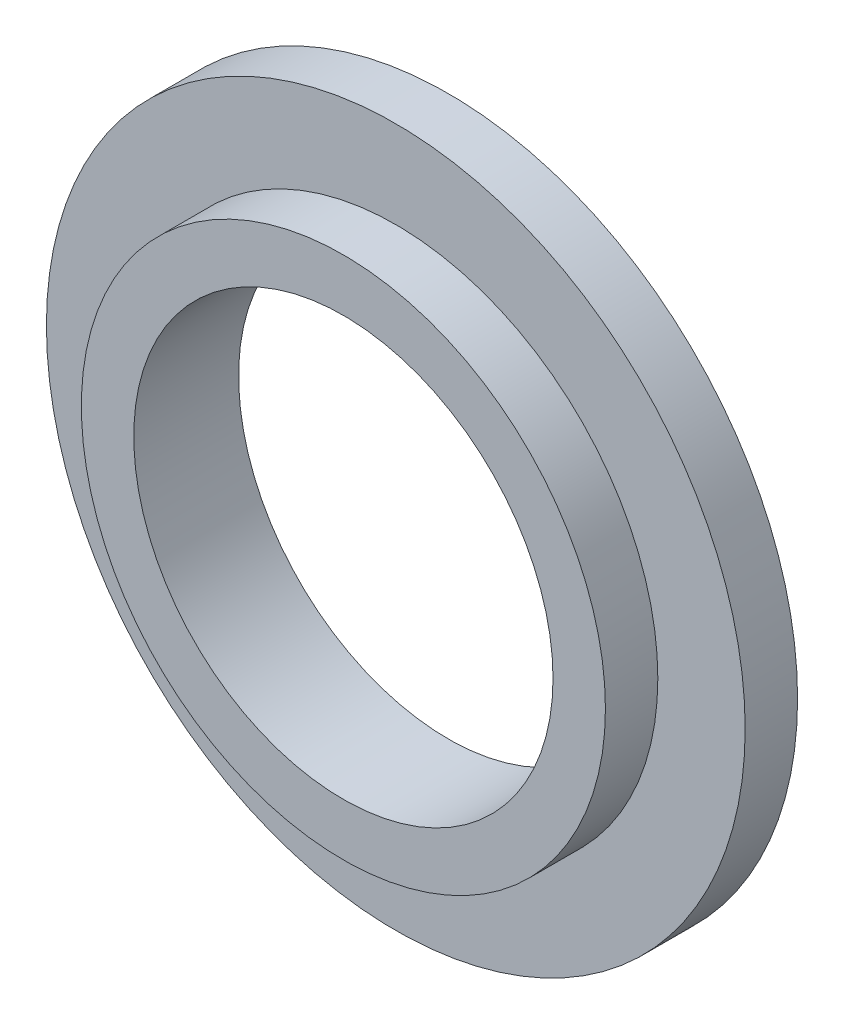
ISO-10303-21;
HEADER;
FILE_DESCRIPTION(('STEP AP214'),'2;1');
FILE_NAME('part.step','',(''),(''),'','','');
FILE_SCHEMA(('AUTOMOTIVE_DESIGN { 1 0 10303 214 1 1 1 1 }'));
ENDSEC;
DATA;
#1=APPLICATION_CONTEXT('core data for automotive mechanical design processes');
#2=APPLICATION_PROTOCOL_DEFINITION('international standard','automotive_design',2000,#1);
#3=PRODUCT_CONTEXT('',#1,'mechanical');
#4=PRODUCT('Part','Part','',(#3));
#5=PRODUCT_RELATED_PRODUCT_CATEGORY('part','',(#4));
#6=PRODUCT_DEFINITION_FORMATION('','',#4);
#7=PRODUCT_DEFINITION_CONTEXT('part definition',#1,'design');
#8=PRODUCT_DEFINITION('design','',#6,#7);
#9=PRODUCT_DEFINITION_SHAPE('','',#8);
#10=(LENGTH_UNIT() NAMED_UNIT(*) SI_UNIT(.MILLI.,.METRE.));
#11=(NAMED_UNIT(*) PLANE_ANGLE_UNIT() SI_UNIT($,.RADIAN.));
#12=(NAMED_UNIT(*) SI_UNIT($,.STERADIAN.) SOLID_ANGLE_UNIT());
#13=UNCERTAINTY_MEASURE_WITH_UNIT(LENGTH_MEASURE(1.E-05),#10,'distance_accuracy_value','');
#14=(GEOMETRIC_REPRESENTATION_CONTEXT(3) GLOBAL_UNCERTAINTY_ASSIGNED_CONTEXT((#13)) GLOBAL_UNIT_ASSIGNED_CONTEXT((#10,
#11,#12)) REPRESENTATION_CONTEXT('',''));
#15=CARTESIAN_POINT('',(0.,0.,0.));
#16=DIRECTION('',(0.,0.,1.));
#17=DIRECTION('',(1.,0.,0.));
#18=AXIS2_PLACEMENT_3D('',#15,#16,#17);
#19=CARTESIAN_POINT('',(0.,0.,1.5));
#20=DIRECTION('',(0.,0.,1.));
#21=DIRECTION('',(1.,0.,0.));
#22=AXIS2_PLACEMENT_3D('',#19,#20,#21);
#23=PLANE('',#22);
#24=CARTESIAN_POINT('',(0.,0.,1.5));
#25=DIRECTION('',(0.,0.,1.));
#26=DIRECTION('',(1.,0.,0.));
#27=AXIS2_PLACEMENT_3D('',#24,#25,#26);
#28=CIRCLE('',#27,10.);
#29=CARTESIAN_POINT('',(10.,0.,1.5));
#30=VERTEX_POINT('',#29);
#31=EDGE_CURVE('E10',#30,#30,#28,.T.);
#32=ORIENTED_EDGE('',*,*,#31,.T.);
#33=EDGE_LOOP('',(#32));
#34=FACE_BOUND('',#33,.T.);
#35=CARTESIAN_POINT('',(0.,0.,1.5));
#36=DIRECTION('',(0.,0.,1.));
#37=DIRECTION('',(1.,0.,0.));
#38=AXIS2_PLACEMENT_3D('',#35,#36,#37);
#39=CIRCLE('',#38,7.5);
#40=CARTESIAN_POINT('',(7.5,0.,1.5));
#41=VERTEX_POINT('',#40);
#42=EDGE_CURVE('E49',#41,#41,#39,.T.);
#43=ORIENTED_EDGE('',*,*,#42,.F.);
#44=EDGE_LOOP('',(#43));
#45=FACE_BOUND('',#44,.T.);
#46=ADVANCED_FACE('F33',(#34,#45),#23,.T.);
#47=CARTESIAN_POINT('',(0.,0.,0.));
#48=DIRECTION('',(0.,0.,1.));
#49=DIRECTION('',(1.,0.,0.));
#50=AXIS2_PLACEMENT_3D('',#47,#48,#49);
#51=PLANE('',#50);
#52=CARTESIAN_POINT('',(0.,0.,0.));
#53=DIRECTION('',(0.,0.,1.));
#54=DIRECTION('',(1.,0.,0.));
#55=AXIS2_PLACEMENT_3D('',#52,#53,#54);
#56=CIRCLE('',#55,10.);
#57=CARTESIAN_POINT('',(10.,0.,0.));
#58=VERTEX_POINT('',#57);
#59=EDGE_CURVE('E37',#58,#58,#56,.T.);
#60=ORIENTED_EDGE('',*,*,#59,.F.);
#61=EDGE_LOOP('',(#60));
#62=FACE_BOUND('',#61,.T.);
#63=CARTESIAN_POINT('',(0.,0.,0.));
#64=DIRECTION('',(0.,0.,1.));
#65=DIRECTION('',(1.,0.,0.));
#66=AXIS2_PLACEMENT_3D('',#63,#64,#65);
#67=CIRCLE('',#66,6.);
#68=CARTESIAN_POINT('',(6.,0.,0.));
#69=VERTEX_POINT('',#68);
#70=EDGE_CURVE('E44',#69,#69,#67,.T.);
#71=ORIENTED_EDGE('',*,*,#70,.T.);
#72=EDGE_LOOP('',(#71));
#73=FACE_BOUND('',#72,.T.);
#74=ADVANCED_FACE('F74',(#62,#73),#51,.F.);
#75=CARTESIAN_POINT('',(0.,0.,1.5));
#76=DIRECTION('',(0.,0.,-1.));
#77=DIRECTION('',(-1.,0.,0.));
#78=AXIS2_PLACEMENT_3D('',#75,#76,#77);
#79=CYLINDRICAL_SURFACE('',#78,10.);
#80=ORIENTED_EDGE('',*,*,#31,.F.);
#81=EDGE_LOOP('',(#80));
#82=FACE_BOUND('',#81,.T.);
#83=ORIENTED_EDGE('',*,*,#59,.T.);
#84=EDGE_LOOP('',(#83));
#85=FACE_BOUND('',#84,.T.);
#86=ADVANCED_FACE('F35',(#82,#85),#79,.T.);
#87=CARTESIAN_POINT('',(0.,0.,1.5));
#88=DIRECTION('',(0.,0.,-1.));
#89=DIRECTION('',(-1.,0.,0.));
#90=AXIS2_PLACEMENT_3D('',#87,#88,#89);
#91=CYLINDRICAL_SURFACE('',#90,6.);
#92=ORIENTED_EDGE('',*,*,#70,.F.);
#93=EDGE_LOOP('',(#92));
#94=FACE_BOUND('',#93,.T.);
#95=CARTESIAN_POINT('',(0.,0.,3.));
#96=DIRECTION('',(0.,0.,1.));
#97=DIRECTION('',(1.,0.,0.));
#98=AXIS2_PLACEMENT_3D('',#95,#96,#97);
#99=CIRCLE('',#98,6.);
#100=CARTESIAN_POINT('',(6.,0.,3.));
#101=VERTEX_POINT('',#100);
#102=EDGE_CURVE('E52',#101,#101,#99,.T.);
#103=ORIENTED_EDGE('',*,*,#102,.T.);
#104=EDGE_LOOP('',(#103));
#105=FACE_BOUND('',#104,.T.);
#106=ADVANCED_FACE('F58',(#94,#105),#91,.F.);
#107=CARTESIAN_POINT('',(0.,0.,3.));
#108=DIRECTION('',(0.,0.,1.));
#109=DIRECTION('',(1.,0.,0.));
#110=AXIS2_PLACEMENT_3D('',#107,#108,#109);
#111=PLANE('',#110);
#112=CARTESIAN_POINT('',(0.,0.,3.));
#113=DIRECTION('',(0.,0.,1.));
#114=DIRECTION('',(1.,0.,0.));
#115=AXIS2_PLACEMENT_3D('',#112,#113,#114);
#116=CIRCLE('',#115,7.5);
#117=CARTESIAN_POINT('',(7.5,0.,3.));
#118=VERTEX_POINT('',#117);
#119=EDGE_CURVE('E48',#118,#118,#116,.T.);
#120=ORIENTED_EDGE('',*,*,#119,.T.);
#121=EDGE_LOOP('',(#120));
#122=FACE_BOUND('',#121,.T.);
#123=ORIENTED_EDGE('',*,*,#102,.F.);
#124=EDGE_LOOP('',(#123));
#125=FACE_BOUND('',#124,.T.);
#126=ADVANCED_FACE('F60',(#122,#125),#111,.T.);
#127=CARTESIAN_POINT('',(0.,0.,3.));
#128=DIRECTION('',(0.,0.,-1.));
#129=DIRECTION('',(-1.,0.,0.));
#130=AXIS2_PLACEMENT_3D('',#127,#128,#129);
#131=CYLINDRICAL_SURFACE('',#130,7.5);
#132=ORIENTED_EDGE('',*,*,#119,.F.);
#133=EDGE_LOOP('',(#132));
#134=FACE_BOUND('',#133,.T.);
#135=ORIENTED_EDGE('',*,*,#42,.T.);
#136=EDGE_LOOP('',(#135));
#137=FACE_BOUND('',#136,.T.);
#138=ADVANCED_FACE('F62',(#134,#137),#131,.T.);
#139=CLOSED_SHELL('',(#46,#74,#86,#106,#126,#138));
#140=MANIFOLD_SOLID_BREP('B2',#139);
#141=ADVANCED_BREP_SHAPE_REPRESENTATION('',(#18,#140),#14);
#142=SHAPE_DEFINITION_REPRESENTATION(#9,#141);
ENDSEC;
END-ISO-10303-21;
